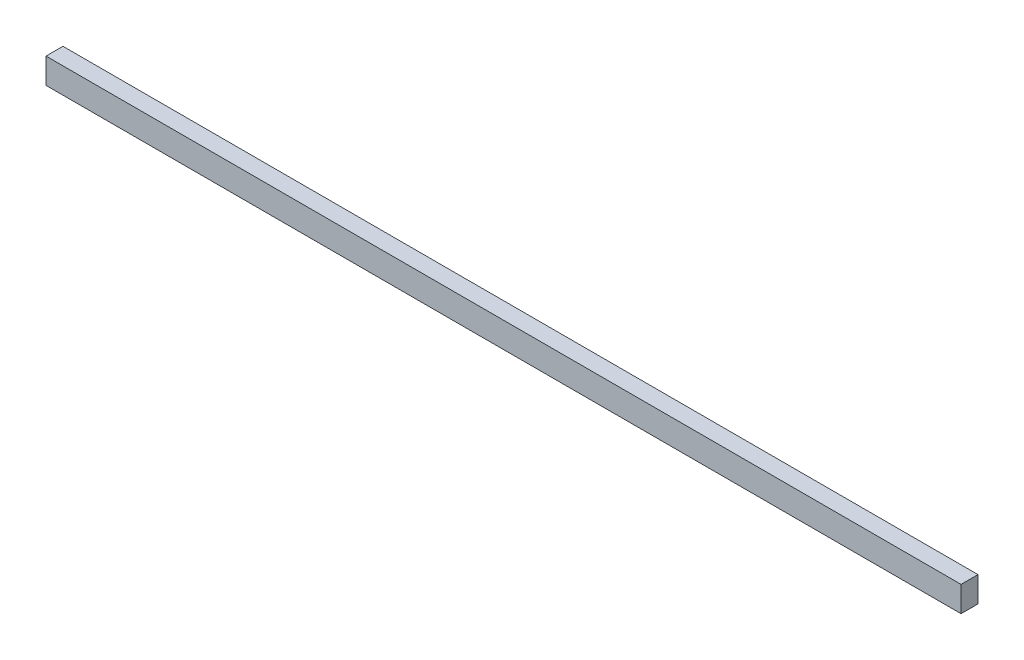
ISO-10303-21;
HEADER;
FILE_DESCRIPTION(('STEP AP214'),'2;1');
FILE_NAME('part.step','',(''),(''),'','','');
FILE_SCHEMA(('AUTOMOTIVE_DESIGN { 1 0 10303 214 1 1 1 1 }'));
ENDSEC;
DATA;
#1=APPLICATION_CONTEXT('core data for automotive mechanical design processes');
#2=APPLICATION_PROTOCOL_DEFINITION('international standard','automotive_design',2000,#1);
#3=PRODUCT_CONTEXT('',#1,'mechanical');
#4=PRODUCT('Part','Part','',(#3));
#5=PRODUCT_RELATED_PRODUCT_CATEGORY('part','',(#4));
#6=PRODUCT_DEFINITION_FORMATION('','',#4);
#7=PRODUCT_DEFINITION_CONTEXT('part definition',#1,'design');
#8=PRODUCT_DEFINITION('design','',#6,#7);
#9=PRODUCT_DEFINITION_SHAPE('','',#8);
#10=(LENGTH_UNIT() NAMED_UNIT(*) SI_UNIT(.MILLI.,.METRE.));
#11=(NAMED_UNIT(*) PLANE_ANGLE_UNIT() SI_UNIT($,.RADIAN.));
#12=(NAMED_UNIT(*) SI_UNIT($,.STERADIAN.) SOLID_ANGLE_UNIT());
#13=UNCERTAINTY_MEASURE_WITH_UNIT(LENGTH_MEASURE(1.E-05),#10,'distance_accuracy_value','');
#14=(GEOMETRIC_REPRESENTATION_CONTEXT(3) GLOBAL_UNCERTAINTY_ASSIGNED_CONTEXT((#13)) GLOBAL_UNIT_ASSIGNED_CONTEXT((#10,
#11,#12)) REPRESENTATION_CONTEXT('',''));
#15=CARTESIAN_POINT('',(0.,0.,0.));
#16=DIRECTION('',(0.,0.,1.));
#17=DIRECTION('',(1.,0.,0.));
#18=AXIS2_PLACEMENT_3D('',#15,#16,#17);
#19=CARTESIAN_POINT('',(540.,-15.,20.));
#20=DIRECTION('',(-1.,0.,0.));
#21=DIRECTION('',(0.,0.,1.));
#22=AXIS2_PLACEMENT_3D('',#19,#20,#21);
#23=PLANE('',#22);
#24=DIRECTION('',(0.,1.,0.));
#25=VECTOR('',#24,1.);
#26=CARTESIAN_POINT('',(540.,-15.,0.));
#27=LINE('',#26,#25);
#28=CARTESIAN_POINT('',(540.,-15.,0.));
#29=VERTEX_POINT('',#28);
#30=CARTESIAN_POINT('',(540.,15.,0.));
#31=VERTEX_POINT('',#30);
#32=EDGE_CURVE('E113',#29,#31,#27,.T.);
#33=ORIENTED_EDGE('',*,*,#32,.T.);
#34=DIRECTION('',(0.,0.,-1.));
#35=VECTOR('',#34,1.);
#36=CARTESIAN_POINT('',(540.,15.,20.));
#37=LINE('',#36,#35);
#38=CARTESIAN_POINT('',(540.,15.,20.));
#39=VERTEX_POINT('',#38);
#40=EDGE_CURVE('E11',#39,#31,#37,.T.);
#41=ORIENTED_EDGE('',*,*,#40,.F.);
#42=DIRECTION('',(0.,1.,0.));
#43=VECTOR('',#42,1.);
#44=CARTESIAN_POINT('',(540.,-15.,20.));
#45=LINE('',#44,#43);
#46=CARTESIAN_POINT('',(540.,-15.,20.));
#47=VERTEX_POINT('',#46);
#48=EDGE_CURVE('E97',#47,#39,#45,.T.);
#49=ORIENTED_EDGE('',*,*,#48,.F.);
#50=DIRECTION('',(0.,0.,-1.));
#51=VECTOR('',#50,1.);
#52=CARTESIAN_POINT('',(540.,-15.,20.));
#53=LINE('',#52,#51);
#54=EDGE_CURVE('E109',#47,#29,#53,.T.);
#55=ORIENTED_EDGE('',*,*,#54,.T.);
#56=EDGE_LOOP('',(#33,#41,#49,#55));
#57=FACE_BOUND('',#56,.T.);
#58=ADVANCED_FACE('F45',(#57),#23,.F.);
#59=CARTESIAN_POINT('',(-540.,15.,20.));
#60=DIRECTION('',(0.,-1.,0.));
#61=DIRECTION('',(0.,0.,-1.));
#62=AXIS2_PLACEMENT_3D('',#59,#60,#61);
#63=PLANE('',#62);
#64=DIRECTION('',(-1.,0.,0.));
#65=VECTOR('',#64,1.);
#66=CARTESIAN_POINT('',(-540.,15.,0.));
#67=LINE('',#66,#65);
#68=CARTESIAN_POINT('',(-540.,15.,0.));
#69=VERTEX_POINT('',#68);
#70=EDGE_CURVE('E102',#31,#69,#67,.T.);
#71=ORIENTED_EDGE('',*,*,#70,.T.);
#72=DIRECTION('',(0.,0.,-1.));
#73=VECTOR('',#72,1.);
#74=CARTESIAN_POINT('',(-540.,15.,20.));
#75=LINE('',#74,#73);
#76=CARTESIAN_POINT('',(-540.,15.,20.));
#77=VERTEX_POINT('',#76);
#78=EDGE_CURVE('E54',#77,#69,#75,.T.);
#79=ORIENTED_EDGE('',*,*,#78,.F.);
#80=DIRECTION('',(-1.,0.,0.));
#81=VECTOR('',#80,1.);
#82=CARTESIAN_POINT('',(-540.,15.,20.));
#83=LINE('',#82,#81);
#84=EDGE_CURVE('E92',#39,#77,#83,.T.);
#85=ORIENTED_EDGE('',*,*,#84,.F.);
#86=ORIENTED_EDGE('',*,*,#40,.T.);
#87=EDGE_LOOP('',(#71,#79,#85,#86));
#88=FACE_BOUND('',#87,.T.);
#89=ADVANCED_FACE('F101',(#88),#63,.F.);
#90=CARTESIAN_POINT('',(-540.,-15.,20.));
#91=DIRECTION('',(1.,0.,0.));
#92=DIRECTION('',(0.,0.,-1.));
#93=AXIS2_PLACEMENT_3D('',#90,#91,#92);
#94=PLANE('',#93);
#95=DIRECTION('',(0.,-1.,0.));
#96=VECTOR('',#95,1.);
#97=CARTESIAN_POINT('',(-540.,-15.,0.));
#98=LINE('',#97,#96);
#99=CARTESIAN_POINT('',(-540.,-15.,0.));
#100=VERTEX_POINT('',#99);
#101=EDGE_CURVE('E79',#69,#100,#98,.T.);
#102=ORIENTED_EDGE('',*,*,#101,.T.);
#103=DIRECTION('',(0.,0.,-1.));
#104=VECTOR('',#103,1.);
#105=CARTESIAN_POINT('',(-540.,-15.,20.));
#106=LINE('',#105,#104);
#107=CARTESIAN_POINT('',(-540.,-15.,20.));
#108=VERTEX_POINT('',#107);
#109=EDGE_CURVE('E104',#108,#100,#106,.T.);
#110=ORIENTED_EDGE('',*,*,#109,.F.);
#111=DIRECTION('',(0.,-1.,0.));
#112=VECTOR('',#111,1.);
#113=CARTESIAN_POINT('',(-540.,-15.,20.));
#114=LINE('',#113,#112);
#115=EDGE_CURVE('E95',#77,#108,#114,.T.);
#116=ORIENTED_EDGE('',*,*,#115,.F.);
#117=ORIENTED_EDGE('',*,*,#78,.T.);
#118=EDGE_LOOP('',(#102,#110,#116,#117));
#119=FACE_BOUND('',#118,.T.);
#120=ADVANCED_FACE('F105',(#119),#94,.F.);
#121=CARTESIAN_POINT('',(-540.,-15.,20.));
#122=DIRECTION('',(0.,1.,0.));
#123=DIRECTION('',(0.,0.,1.));
#124=AXIS2_PLACEMENT_3D('',#121,#122,#123);
#125=PLANE('',#124);
#126=DIRECTION('',(1.,0.,0.));
#127=VECTOR('',#126,1.);
#128=CARTESIAN_POINT('',(-540.,-15.,0.));
#129=LINE('',#128,#127);
#130=EDGE_CURVE('E85',#100,#29,#129,.T.);
#131=ORIENTED_EDGE('',*,*,#130,.T.);
#132=ORIENTED_EDGE('',*,*,#54,.F.);
#133=DIRECTION('',(1.,0.,0.));
#134=VECTOR('',#133,1.);
#135=CARTESIAN_POINT('',(-540.,-15.,20.));
#136=LINE('',#135,#134);
#137=EDGE_CURVE('E62',#108,#47,#136,.T.);
#138=ORIENTED_EDGE('',*,*,#137,.F.);
#139=ORIENTED_EDGE('',*,*,#109,.T.);
#140=EDGE_LOOP('',(#131,#132,#138,#139));
#141=FACE_BOUND('',#140,.T.);
#142=ADVANCED_FACE('F126',(#141),#125,.F.);
#143=CARTESIAN_POINT('',(0.,0.,20.));
#144=DIRECTION('',(0.,0.,-1.));
#145=DIRECTION('',(-1.,0.,0.));
#146=AXIS2_PLACEMENT_3D('',#143,#144,#145);
#147=PLANE('',#146);
#148=ORIENTED_EDGE('',*,*,#48,.T.);
#149=ORIENTED_EDGE('',*,*,#84,.T.);
#150=ORIENTED_EDGE('',*,*,#115,.T.);
#151=ORIENTED_EDGE('',*,*,#137,.T.);
#152=EDGE_LOOP('',(#148,#149,#150,#151));
#153=FACE_BOUND('',#152,.T.);
#154=ADVANCED_FACE('F93',(#153),#147,.F.);
#155=CARTESIAN_POINT('',(0.,0.,0.));
#156=DIRECTION('',(0.,0.,-1.));
#157=DIRECTION('',(-1.,0.,0.));
#158=AXIS2_PLACEMENT_3D('',#155,#156,#157);
#159=PLANE('',#158);
#160=ORIENTED_EDGE('',*,*,#32,.F.);
#161=ORIENTED_EDGE('',*,*,#130,.F.);
#162=ORIENTED_EDGE('',*,*,#101,.F.);
#163=ORIENTED_EDGE('',*,*,#70,.F.);
#164=EDGE_LOOP('',(#160,#161,#162,#163));
#165=FACE_BOUND('',#164,.T.);
#166=ADVANCED_FACE('F129',(#165),#159,.T.);
#167=CLOSED_SHELL('',(#58,#89,#120,#142,#154,#166));
#168=MANIFOLD_SOLID_BREP('B2',#167);
#169=ADVANCED_BREP_SHAPE_REPRESENTATION('',(#18,#168),#14);
#170=SHAPE_DEFINITION_REPRESENTATION(#9,#169);
ENDSEC;
END-ISO-10303-21;
